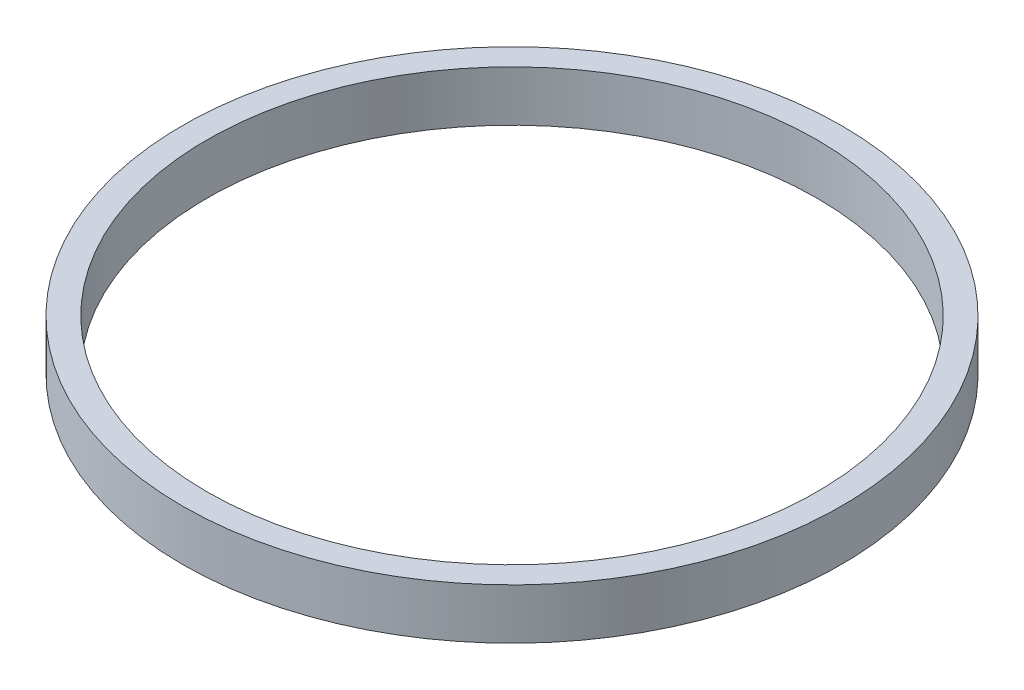
ISO-10303-21;
HEADER;
FILE_DESCRIPTION(('STEP AP214'),'2;1');
FILE_NAME('part.step','',(''),(''),'','','');
FILE_SCHEMA(('AUTOMOTIVE_DESIGN { 1 0 10303 214 1 1 1 1 }'));
ENDSEC;
DATA;
#1=APPLICATION_CONTEXT('core data for automotive mechanical design processes');
#2=APPLICATION_PROTOCOL_DEFINITION('international standard','automotive_design',2000,#1);
#3=PRODUCT_CONTEXT('',#1,'mechanical');
#4=PRODUCT('Part','Part','',(#3));
#5=PRODUCT_RELATED_PRODUCT_CATEGORY('part','',(#4));
#6=PRODUCT_DEFINITION_FORMATION('','',#4);
#7=PRODUCT_DEFINITION_CONTEXT('part definition',#1,'design');
#8=PRODUCT_DEFINITION('design','',#6,#7);
#9=PRODUCT_DEFINITION_SHAPE('','',#8);
#10=(LENGTH_UNIT() NAMED_UNIT(*) SI_UNIT(.MILLI.,.METRE.));
#11=(NAMED_UNIT(*) PLANE_ANGLE_UNIT() SI_UNIT($,.RADIAN.));
#12=(NAMED_UNIT(*) SI_UNIT($,.STERADIAN.) SOLID_ANGLE_UNIT());
#13=UNCERTAINTY_MEASURE_WITH_UNIT(LENGTH_MEASURE(1.E-05),#10,'distance_accuracy_value','');
#14=(GEOMETRIC_REPRESENTATION_CONTEXT(3) GLOBAL_UNCERTAINTY_ASSIGNED_CONTEXT((#13)) GLOBAL_UNIT_ASSIGNED_CONTEXT((#10,
#11,#12)) REPRESENTATION_CONTEXT('',''));
#15=CARTESIAN_POINT('',(0.,0.,0.));
#16=DIRECTION('',(0.,0.,1.));
#17=DIRECTION('',(1.,0.,0.));
#18=AXIS2_PLACEMENT_3D('',#15,#16,#17);
#19=CARTESIAN_POINT('',(0.,5.,0.));
#20=DIRECTION('',(0.,1.,0.));
#21=DIRECTION('',(0.,0.,1.));
#22=AXIS2_PLACEMENT_3D('',#19,#20,#21);
#23=PLANE('',#22);
#24=CARTESIAN_POINT('',(0.,5.,0.));
#25=DIRECTION('',(0.,1.,0.));
#26=DIRECTION('',(0.,0.,1.));
#27=AXIS2_PLACEMENT_3D('',#24,#25,#26);
#28=CIRCLE('',#27,32.6);
#29=CARTESIAN_POINT('',(0.,5.,32.6));
#30=VERTEX_POINT('',#29);
#31=EDGE_CURVE('E10',#30,#30,#28,.T.);
#32=ORIENTED_EDGE('',*,*,#31,.T.);
#33=EDGE_LOOP('',(#32));
#34=FACE_BOUND('',#33,.T.);
#35=CARTESIAN_POINT('',(0.,5.,0.));
#36=DIRECTION('',(0.,1.,0.));
#37=DIRECTION('',(0.,0.,1.));
#38=AXIS2_PLACEMENT_3D('',#35,#36,#37);
#39=CIRCLE('',#38,30.165);
#40=CARTESIAN_POINT('',(0.,5.,30.165));
#41=VERTEX_POINT('',#40);
#42=EDGE_CURVE('E50',#41,#41,#39,.T.);
#43=ORIENTED_EDGE('',*,*,#42,.F.);
#44=EDGE_LOOP('',(#43));
#45=FACE_BOUND('',#44,.T.);
#46=ADVANCED_FACE('F37',(#34,#45),#23,.T.);
#47=CARTESIAN_POINT('',(0.,0.,0.));
#48=DIRECTION('',(0.,1.,0.));
#49=DIRECTION('',(0.,0.,1.));
#50=AXIS2_PLACEMENT_3D('',#47,#48,#49);
#51=PLANE('',#50);
#52=CARTESIAN_POINT('',(0.,0.,0.));
#53=DIRECTION('',(0.,1.,0.));
#54=DIRECTION('',(0.,0.,1.));
#55=AXIS2_PLACEMENT_3D('',#52,#53,#54);
#56=CIRCLE('',#55,32.6);
#57=CARTESIAN_POINT('',(0.,0.,32.6));
#58=VERTEX_POINT('',#57);
#59=EDGE_CURVE('E41',#58,#58,#56,.T.);
#60=ORIENTED_EDGE('',*,*,#59,.F.);
#61=EDGE_LOOP('',(#60));
#62=FACE_BOUND('',#61,.T.);
#63=CARTESIAN_POINT('',(0.,0.,0.));
#64=DIRECTION('',(0.,1.,0.));
#65=DIRECTION('',(0.,0.,1.));
#66=AXIS2_PLACEMENT_3D('',#63,#64,#65);
#67=CIRCLE('',#66,30.165);
#68=CARTESIAN_POINT('',(0.,0.,30.165));
#69=VERTEX_POINT('',#68);
#70=EDGE_CURVE('E52',#69,#69,#67,.T.);
#71=ORIENTED_EDGE('',*,*,#70,.T.);
#72=EDGE_LOOP('',(#71));
#73=FACE_BOUND('',#72,.T.);
#74=ADVANCED_FACE('F64',(#62,#73),#51,.F.);
#75=CARTESIAN_POINT('',(0.,5.,0.));
#76=DIRECTION('',(0.,-1.,0.));
#77=DIRECTION('',(0.,0.,-1.));
#78=AXIS2_PLACEMENT_3D('',#75,#76,#77);
#79=CYLINDRICAL_SURFACE('',#78,32.6);
#80=ORIENTED_EDGE('',*,*,#31,.F.);
#81=EDGE_LOOP('',(#80));
#82=FACE_BOUND('',#81,.T.);
#83=ORIENTED_EDGE('',*,*,#59,.T.);
#84=EDGE_LOOP('',(#83));
#85=FACE_BOUND('',#84,.T.);
#86=ADVANCED_FACE('F39',(#82,#85),#79,.T.);
#87=CARTESIAN_POINT('',(0.,5.,0.));
#88=DIRECTION('',(0.,-1.,0.));
#89=DIRECTION('',(0.,0.,-1.));
#90=AXIS2_PLACEMENT_3D('',#87,#88,#89);
#91=CYLINDRICAL_SURFACE('',#90,30.165);
#92=ORIENTED_EDGE('',*,*,#42,.T.);
#93=EDGE_LOOP('',(#92));
#94=FACE_BOUND('',#93,.T.);
#95=ORIENTED_EDGE('',*,*,#70,.F.);
#96=EDGE_LOOP('',(#95));
#97=FACE_BOUND('',#96,.T.);
#98=ADVANCED_FACE('F60',(#94,#97),#91,.F.);
#99=CLOSED_SHELL('',(#46,#74,#86,#98));
#100=MANIFOLD_SOLID_BREP('B2',#99);
#101=ADVANCED_BREP_SHAPE_REPRESENTATION('',(#18,#100),#14);
#102=SHAPE_DEFINITION_REPRESENTATION(#9,#101);
ENDSEC;
END-ISO-10303-21;
